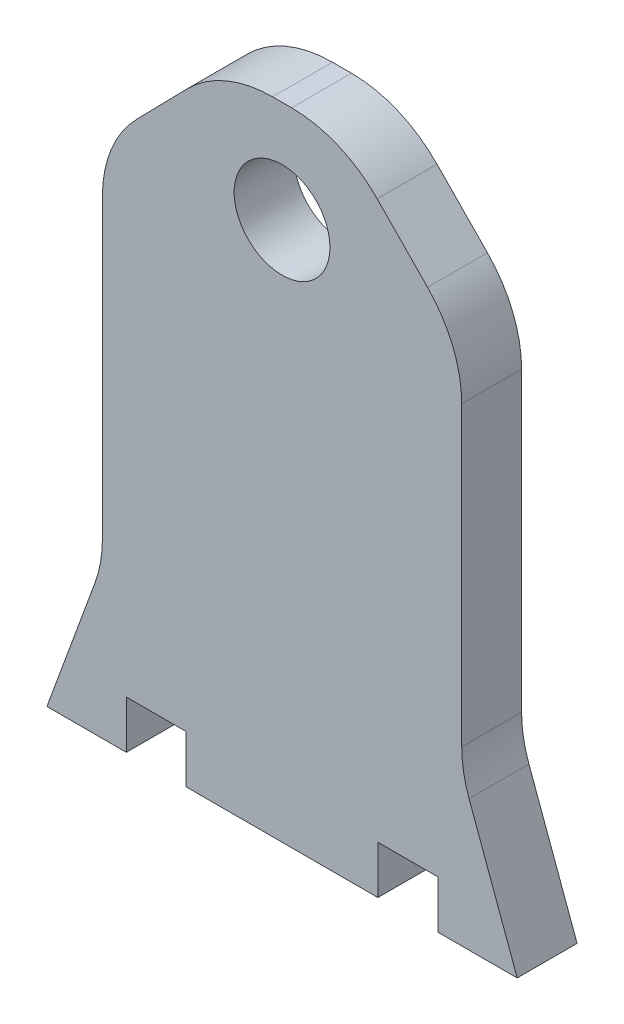
ISO-10303-21;
HEADER;
FILE_DESCRIPTION(('STEP AP214'),'2;1');
FILE_NAME('part.step','',(''),(''),'','','');
FILE_SCHEMA(('AUTOMOTIVE_DESIGN { 1 0 10303 214 1 1 1 1 }'));
ENDSEC;
DATA;
#1=APPLICATION_CONTEXT('core data for automotive mechanical design processes');
#2=APPLICATION_PROTOCOL_DEFINITION('international standard','automotive_design',2000,#1);
#3=PRODUCT_CONTEXT('',#1,'mechanical');
#4=PRODUCT('Part','Part','',(#3));
#5=PRODUCT_RELATED_PRODUCT_CATEGORY('part','',(#4));
#6=PRODUCT_DEFINITION_FORMATION('','',#4);
#7=PRODUCT_DEFINITION_CONTEXT('part definition',#1,'design');
#8=PRODUCT_DEFINITION('design','',#6,#7);
#9=PRODUCT_DEFINITION_SHAPE('','',#8);
#10=(LENGTH_UNIT() NAMED_UNIT(*) SI_UNIT(.MILLI.,.METRE.));
#11=(NAMED_UNIT(*) PLANE_ANGLE_UNIT() SI_UNIT($,.RADIAN.));
#12=(NAMED_UNIT(*) SI_UNIT($,.STERADIAN.) SOLID_ANGLE_UNIT());
#13=UNCERTAINTY_MEASURE_WITH_UNIT(LENGTH_MEASURE(1.E-05),#10,'distance_accuracy_value','');
#14=(GEOMETRIC_REPRESENTATION_CONTEXT(3) GLOBAL_UNCERTAINTY_ASSIGNED_CONTEXT((#13)) GLOBAL_UNIT_ASSIGNED_CONTEXT((#10,
#11,#12)) REPRESENTATION_CONTEXT('',''));
#15=CARTESIAN_POINT('',(0.,0.,0.));
#16=DIRECTION('',(0.,0.,1.));
#17=DIRECTION('',(1.,0.,0.));
#18=AXIS2_PLACEMENT_3D('',#15,#16,#17);
#19=CARTESIAN_POINT('',(15.,-33.5,5.));
#20=DIRECTION('',(-1.,0.,0.));
#21=DIRECTION('',(0.,0.,1.));
#22=AXIS2_PLACEMENT_3D('',#19,#20,#21);
#23=PLANE('',#22);
#24=DIRECTION('',(0.,1.,0.));
#25=VECTOR('',#24,1.);
#26=CARTESIAN_POINT('',(15.,-33.5,5.));
#27=LINE('',#26,#25);
#28=CARTESIAN_POINT('',(15.,-18.0980728460624,5.));
#29=VERTEX_POINT('',#28);
#30=CARTESIAN_POINT('',(15.,6.70234804023753,5.));
#31=VERTEX_POINT('',#30);
#32=EDGE_CURVE('E277',#29,#31,#27,.T.);
#33=ORIENTED_EDGE('',*,*,#32,.F.);
#34=DIRECTION('',(0.,0.,1.));
#35=VECTOR('',#34,1.);
#36=CARTESIAN_POINT('',(15.,-18.0980728460624,5.));
#37=LINE('',#36,#35);
#38=CARTESIAN_POINT('',(15.,-18.0980728460624,0.));
#39=VERTEX_POINT('',#38);
#40=EDGE_CURVE('E58',#29,#39,#37,.F.);
#41=ORIENTED_EDGE('',*,*,#40,.T.);
#42=DIRECTION('',(0.,1.,0.));
#43=VECTOR('',#42,1.);
#44=CARTESIAN_POINT('',(15.,-33.5,0.));
#45=LINE('',#44,#43);
#46=CARTESIAN_POINT('',(15.,6.70234804023753,0.));
#47=VERTEX_POINT('',#46);
#48=EDGE_CURVE('E274',#39,#47,#45,.T.);
#49=ORIENTED_EDGE('',*,*,#48,.T.);
#50=DIRECTION('',(0.,0.,1.));
#51=VECTOR('',#50,1.);
#52=CARTESIAN_POINT('',(15.,6.70234804023753,5.));
#53=LINE('',#52,#51);
#54=EDGE_CURVE('E194',#47,#31,#53,.T.);
#55=ORIENTED_EDGE('',*,*,#54,.T.);
#56=EDGE_LOOP('',(#33,#41,#49,#55));
#57=FACE_BOUND('',#56,.T.);
#58=ADVANCED_FACE('F37',(#57),#23,.F.);
#59=CARTESIAN_POINT('',(0.,0.,5.));
#60=DIRECTION('',(0.,0.,-1.));
#61=DIRECTION('',(-1.,0.,0.));
#62=AXIS2_PLACEMENT_3D('',#59,#60,#61);
#63=PLANE('',#62);
#64=DIRECTION('',(-0.344507703036126,0.938783490773444,0.));
#65=VECTOR('',#64,1.);
#66=CARTESIAN_POINT('',(15.,-19.875,5.));
#67=LINE('',#66,#65);
#68=CARTESIAN_POINT('',(19.6330275229358,-32.5,5.));
#69=VERTEX_POINT('',#68);
#70=CARTESIAN_POINT('',(15.6121650922656,-21.5431498764237,5.));
#71=VERTEX_POINT('',#70);
#72=EDGE_CURVE('E200',#69,#71,#67,.T.);
#73=ORIENTED_EDGE('',*,*,#72,.T.);
#74=CARTESIAN_POINT('',(25.,-18.0980728460624,5.));
#75=DIRECTION('',(0.,0.,-1.));
#76=DIRECTION('',(-1.,0.,0.));
#77=AXIS2_PLACEMENT_3D('',#74,#75,#76);
#78=CIRCLE('',#77,10.);
#79=EDGE_CURVE('E45',#71,#29,#78,.T.);
#80=ORIENTED_EDGE('',*,*,#79,.T.);
#81=ORIENTED_EDGE('',*,*,#32,.T.);
#82=CARTESIAN_POINT('',(5.,6.70234804023753,5.));
#83=DIRECTION('',(0.,0.,-1.));
#84=DIRECTION('',(-1.,0.,0.));
#85=AXIS2_PLACEMENT_3D('',#82,#83,#84);
#86=CIRCLE('',#85,10.);
#87=CARTESIAN_POINT('',(12.1471525735543,13.6965034638992,5.));
#88=VERTEX_POINT('',#87);
#89=EDGE_CURVE('E293',#31,#88,#86,.F.);
#90=ORIENTED_EDGE('',*,*,#89,.T.);
#91=DIRECTION('',(0.699415542366169,-0.714715257355429,0.));
#92=VECTOR('',#91,1.);
#93=CARTESIAN_POINT('',(15.,10.78125,5.));
#94=LINE('',#93,#92);
#95=CARTESIAN_POINT('',(7.94149927959712,17.9941554236617,5.));
#96=VERTEX_POINT('',#95);
#97=EDGE_CURVE('E376',#96,#88,#94,.T.);
#98=ORIENTED_EDGE('',*,*,#97,.F.);
#99=CARTESIAN_POINT('',(0.794346706042831,11.,5.));
#100=DIRECTION('',(0.,0.,-1.));
#101=DIRECTION('',(-1.,0.,0.));
#102=AXIS2_PLACEMENT_3D('',#99,#100,#101);
#103=CIRCLE('',#102,10.);
#104=CARTESIAN_POINT('',(0.794346706042831,21.,5.));
#105=VERTEX_POINT('',#104);
#106=EDGE_CURVE('E289',#96,#105,#103,.F.);
#107=ORIENTED_EDGE('',*,*,#106,.T.);
#108=DIRECTION('',(1.,0.,0.));
#109=VECTOR('',#108,1.);
#110=CARTESIAN_POINT('',(-15.,21.,5.));
#111=LINE('',#110,#109);
#112=CARTESIAN_POINT('',(-0.794346706042826,21.,5.));
#113=VERTEX_POINT('',#112);
#114=EDGE_CURVE('E243',#113,#105,#111,.T.);
#115=ORIENTED_EDGE('',*,*,#114,.F.);
#116=CARTESIAN_POINT('',(-0.794346706042825,11.,5.));
#117=DIRECTION('',(0.,0.,-1.));
#118=DIRECTION('',(-1.,0.,0.));
#119=AXIS2_PLACEMENT_3D('',#116,#117,#118);
#120=CIRCLE('',#119,10.);
#121=CARTESIAN_POINT('',(-7.94149927959712,17.9941554236617,5.));
#122=VERTEX_POINT('',#121);
#123=EDGE_CURVE('E287',#113,#122,#120,.F.);
#124=ORIENTED_EDGE('',*,*,#123,.T.);
#125=DIRECTION('',(0.699415542366169,0.714715257355429,0.));
#126=VECTOR('',#125,1.);
#127=CARTESIAN_POINT('',(-15.,10.78125,5.));
#128=LINE('',#127,#126);
#129=CARTESIAN_POINT('',(-12.1471525735543,13.6965034638992,5.));
#130=VERTEX_POINT('',#129);
#131=EDGE_CURVE('E374',#130,#122,#128,.T.);
#132=ORIENTED_EDGE('',*,*,#131,.F.);
#133=CARTESIAN_POINT('',(-5.,6.70234804023752,5.));
#134=DIRECTION('',(0.,0.,-1.));
#135=DIRECTION('',(-1.,0.,0.));
#136=AXIS2_PLACEMENT_3D('',#133,#134,#135);
#137=CIRCLE('',#136,10.);
#138=CARTESIAN_POINT('',(-15.,6.70234804023752,5.));
#139=VERTEX_POINT('',#138);
#140=EDGE_CURVE('E291',#130,#139,#137,.F.);
#141=ORIENTED_EDGE('',*,*,#140,.T.);
#142=DIRECTION('',(0.,-1.,0.));
#143=VECTOR('',#142,1.);
#144=CARTESIAN_POINT('',(-15.,-33.5,5.));
#145=LINE('',#144,#143);
#146=CARTESIAN_POINT('',(-15.,-18.0980728460624,5.));
#147=VERTEX_POINT('',#146);
#148=EDGE_CURVE('E195',#139,#147,#145,.T.);
#149=ORIENTED_EDGE('',*,*,#148,.T.);
#150=CARTESIAN_POINT('',(-25.,-18.0980728460624,5.));
#151=DIRECTION('',(0.,0.,-1.));
#152=DIRECTION('',(-1.,0.,0.));
#153=AXIS2_PLACEMENT_3D('',#150,#151,#152);
#154=CIRCLE('',#153,10.);
#155=CARTESIAN_POINT('',(-15.6121650922656,-21.5431498764237,5.));
#156=VERTEX_POINT('',#155);
#157=EDGE_CURVE('E328',#147,#156,#154,.T.);
#158=ORIENTED_EDGE('',*,*,#157,.T.);
#159=DIRECTION('',(-0.344507703036126,-0.938783490773444,0.));
#160=VECTOR('',#159,1.);
#161=CARTESIAN_POINT('',(-15.,-19.875,5.));
#162=LINE('',#161,#160);
#163=CARTESIAN_POINT('',(-19.6330275229358,-32.5,5.));
#164=VERTEX_POINT('',#163);
#165=EDGE_CURVE('E211',#156,#164,#162,.T.);
#166=ORIENTED_EDGE('',*,*,#165,.T.);
#167=DIRECTION('',(-1.,0.,0.));
#168=VECTOR('',#167,1.);
#169=CARTESIAN_POINT('',(-20.,-32.5,5.));
#170=LINE('',#169,#168);
#171=CARTESIAN_POINT('',(-13.,-32.5,5.));
#172=VERTEX_POINT('',#171);
#173=EDGE_CURVE('E206',#172,#164,#170,.T.);
#174=ORIENTED_EDGE('',*,*,#173,.F.);
#175=DIRECTION('',(0.,-1.,0.));
#176=VECTOR('',#175,1.);
#177=CARTESIAN_POINT('',(-13.,-33.5,5.));
#178=LINE('',#177,#176);
#179=CARTESIAN_POINT('',(-13.,-28.5,5.));
#180=VERTEX_POINT('',#179);
#181=EDGE_CURVE('E251',#180,#172,#178,.T.);
#182=ORIENTED_EDGE('',*,*,#181,.F.);
#183=DIRECTION('',(-1.,0.,0.));
#184=VECTOR('',#183,1.);
#185=CARTESIAN_POINT('',(-13.,-28.5,5.));
#186=LINE('',#185,#184);
#187=CARTESIAN_POINT('',(-8.,-28.5,5.));
#188=VERTEX_POINT('',#187);
#189=EDGE_CURVE('E254',#188,#180,#186,.T.);
#190=ORIENTED_EDGE('',*,*,#189,.F.);
#191=DIRECTION('',(0.,1.,0.));
#192=VECTOR('',#191,1.);
#193=CARTESIAN_POINT('',(-8.,-33.5,5.));
#194=LINE('',#193,#192);
#195=CARTESIAN_POINT('',(-8.,-32.5,5.));
#196=VERTEX_POINT('',#195);
#197=EDGE_CURVE('E237',#196,#188,#194,.T.);
#198=ORIENTED_EDGE('',*,*,#197,.F.);
#199=CARTESIAN_POINT('',(8.,-32.5,5.));
#200=VERTEX_POINT('',#199);
#201=EDGE_CURVE('E204',#200,#196,#170,.T.);
#202=ORIENTED_EDGE('',*,*,#201,.F.);
#203=DIRECTION('',(0.,-1.,0.));
#204=VECTOR('',#203,1.);
#205=CARTESIAN_POINT('',(8.,-33.5,5.));
#206=LINE('',#205,#204);
#207=CARTESIAN_POINT('',(8.,-28.5,5.));
#208=VERTEX_POINT('',#207);
#209=EDGE_CURVE('E234',#208,#200,#206,.T.);
#210=ORIENTED_EDGE('',*,*,#209,.F.);
#211=DIRECTION('',(-1.,0.,0.));
#212=VECTOR('',#211,1.);
#213=CARTESIAN_POINT('',(8.,-28.5,5.));
#214=LINE('',#213,#212);
#215=CARTESIAN_POINT('',(13.,-28.5,5.));
#216=VERTEX_POINT('',#215);
#217=EDGE_CURVE('E228',#216,#208,#214,.T.);
#218=ORIENTED_EDGE('',*,*,#217,.F.);
#219=DIRECTION('',(0.,1.,0.));
#220=VECTOR('',#219,1.);
#221=CARTESIAN_POINT('',(13.,-33.5,5.));
#222=LINE('',#221,#220);
#223=CARTESIAN_POINT('',(13.,-32.5,5.));
#224=VERTEX_POINT('',#223);
#225=EDGE_CURVE('E202',#224,#216,#222,.T.);
#226=ORIENTED_EDGE('',*,*,#225,.F.);
#227=EDGE_CURVE('E186',#69,#224,#170,.T.);
#228=ORIENTED_EDGE('',*,*,#227,.F.);
#229=EDGE_LOOP('',(#73,#80,#81,#90,#98,#107,#115,#124,#132,#141,#149,#158,#166,#174,#182,#190,
#198,#202,#210,#218,#226,#228));
#230=FACE_BOUND('',#229,.T.);
#231=CARTESIAN_POINT('',(0.,12.5,5.));
#232=DIRECTION('',(0.,0.,1.));
#233=DIRECTION('',(1.,0.,0.));
#234=AXIS2_PLACEMENT_3D('',#231,#232,#233);
#235=CIRCLE('',#234,4.);
#236=CARTESIAN_POINT('',(4.,12.5,5.));
#237=VERTEX_POINT('',#236);
#238=EDGE_CURVE('E271',#237,#237,#235,.T.);
#239=ORIENTED_EDGE('',*,*,#238,.F.);
#240=EDGE_LOOP('',(#239));
#241=FACE_BOUND('',#240,.T.);
#242=ADVANCED_FACE('F198',(#230,#241),#63,.F.);
#243=CARTESIAN_POINT('',(0.,0.,0.));
#244=DIRECTION('',(0.,0.,-1.));
#245=DIRECTION('',(-1.,0.,0.));
#246=AXIS2_PLACEMENT_3D('',#243,#244,#245);
#247=PLANE('',#246);
#248=DIRECTION('',(0.699415542366169,-0.714715257355429,0.));
#249=VECTOR('',#248,1.);
#250=CARTESIAN_POINT('',(15.,10.78125,0.));
#251=LINE('',#250,#249);
#252=CARTESIAN_POINT('',(7.94149927959712,17.9941554236617,0.));
#253=VERTEX_POINT('',#252);
#254=CARTESIAN_POINT('',(12.1471525735543,13.6965034638992,0.));
#255=VERTEX_POINT('',#254);
#256=EDGE_CURVE('E219',#253,#255,#251,.T.);
#257=ORIENTED_EDGE('',*,*,#256,.T.);
#258=CARTESIAN_POINT('',(5.,6.70234804023753,0.));
#259=DIRECTION('',(0.,0.,-1.));
#260=DIRECTION('',(-1.,0.,0.));
#261=AXIS2_PLACEMENT_3D('',#258,#259,#260);
#262=CIRCLE('',#261,10.);
#263=EDGE_CURVE('E306',#255,#47,#262,.T.);
#264=ORIENTED_EDGE('',*,*,#263,.T.);
#265=ORIENTED_EDGE('',*,*,#48,.F.);
#266=CARTESIAN_POINT('',(25.,-18.0980728460624,0.));
#267=DIRECTION('',(0.,0.,-1.));
#268=DIRECTION('',(-1.,0.,0.));
#269=AXIS2_PLACEMENT_3D('',#266,#267,#268);
#270=CIRCLE('',#269,10.);
#271=CARTESIAN_POINT('',(15.6121650922656,-21.5431498764237,0.));
#272=VERTEX_POINT('',#271);
#273=EDGE_CURVE('E11',#39,#272,#270,.F.);
#274=ORIENTED_EDGE('',*,*,#273,.T.);
#275=DIRECTION('',(-0.344507703036126,0.938783490773444,0.));
#276=VECTOR('',#275,1.);
#277=CARTESIAN_POINT('',(15.,-19.875,0.));
#278=LINE('',#277,#276);
#279=CARTESIAN_POINT('',(19.6330275229358,-32.5,0.));
#280=VERTEX_POINT('',#279);
#281=EDGE_CURVE('E212',#280,#272,#278,.T.);
#282=ORIENTED_EDGE('',*,*,#281,.F.);
#283=DIRECTION('',(-1.,0.,0.));
#284=VECTOR('',#283,1.);
#285=CARTESIAN_POINT('',(-20.,-32.5,0.));
#286=LINE('',#285,#284);
#287=CARTESIAN_POINT('',(13.,-32.5,0.));
#288=VERTEX_POINT('',#287);
#289=EDGE_CURVE('E189',#280,#288,#286,.T.);
#290=ORIENTED_EDGE('',*,*,#289,.T.);
#291=DIRECTION('',(0.,1.,0.));
#292=VECTOR('',#291,1.);
#293=CARTESIAN_POINT('',(13.,-33.5,0.));
#294=LINE('',#293,#292);
#295=CARTESIAN_POINT('',(13.,-28.5,0.));
#296=VERTEX_POINT('',#295);
#297=EDGE_CURVE('E227',#288,#296,#294,.T.);
#298=ORIENTED_EDGE('',*,*,#297,.T.);
#299=DIRECTION('',(-1.,0.,0.));
#300=VECTOR('',#299,1.);
#301=CARTESIAN_POINT('',(8.,-28.5,0.));
#302=LINE('',#301,#300);
#303=CARTESIAN_POINT('',(8.,-28.5,0.));
#304=VERTEX_POINT('',#303);
#305=EDGE_CURVE('E230',#296,#304,#302,.T.);
#306=ORIENTED_EDGE('',*,*,#305,.T.);
#307=DIRECTION('',(0.,-1.,0.));
#308=VECTOR('',#307,1.);
#309=CARTESIAN_POINT('',(8.,-33.5,0.));
#310=LINE('',#309,#308);
#311=CARTESIAN_POINT('',(8.,-32.5,0.));
#312=VERTEX_POINT('',#311);
#313=EDGE_CURVE('E224',#304,#312,#310,.T.);
#314=ORIENTED_EDGE('',*,*,#313,.T.);
#315=CARTESIAN_POINT('',(-8.,-32.5,0.));
#316=VERTEX_POINT('',#315);
#317=EDGE_CURVE('E361',#312,#316,#286,.T.);
#318=ORIENTED_EDGE('',*,*,#317,.T.);
#319=DIRECTION('',(0.,1.,0.));
#320=VECTOR('',#319,1.);
#321=CARTESIAN_POINT('',(-8.,-33.5,0.));
#322=LINE('',#321,#320);
#323=CARTESIAN_POINT('',(-8.,-28.5,0.));
#324=VERTEX_POINT('',#323);
#325=EDGE_CURVE('E255',#316,#324,#322,.T.);
#326=ORIENTED_EDGE('',*,*,#325,.T.);
#327=DIRECTION('',(-1.,0.,0.));
#328=VECTOR('',#327,1.);
#329=CARTESIAN_POINT('',(-13.,-28.5,0.));
#330=LINE('',#329,#328);
#331=CARTESIAN_POINT('',(-13.,-28.5,0.));
#332=VERTEX_POINT('',#331);
#333=EDGE_CURVE('E261',#324,#332,#330,.T.);
#334=ORIENTED_EDGE('',*,*,#333,.T.);
#335=DIRECTION('',(0.,-1.,0.));
#336=VECTOR('',#335,1.);
#337=CARTESIAN_POINT('',(-13.,-33.5,0.));
#338=LINE('',#337,#336);
#339=CARTESIAN_POINT('',(-13.,-32.5,0.));
#340=VERTEX_POINT('',#339);
#341=EDGE_CURVE('E249',#332,#340,#338,.T.);
#342=ORIENTED_EDGE('',*,*,#341,.T.);
#343=CARTESIAN_POINT('',(-19.6330275229358,-32.5,0.));
#344=VERTEX_POINT('',#343);
#345=EDGE_CURVE('E203',#340,#344,#286,.T.);
#346=ORIENTED_EDGE('',*,*,#345,.T.);
#347=DIRECTION('',(-0.344507703036126,-0.938783490773444,0.));
#348=VECTOR('',#347,1.);
#349=CARTESIAN_POINT('',(-15.,-19.875,0.));
#350=LINE('',#349,#348);
#351=CARTESIAN_POINT('',(-15.6121650922656,-21.5431498764237,0.));
#352=VERTEX_POINT('',#351);
#353=EDGE_CURVE('E214',#352,#344,#350,.T.);
#354=ORIENTED_EDGE('',*,*,#353,.F.);
#355=CARTESIAN_POINT('',(-25.,-18.0980728460624,0.));
#356=DIRECTION('',(0.,0.,-1.));
#357=DIRECTION('',(-1.,0.,0.));
#358=AXIS2_PLACEMENT_3D('',#355,#356,#357);
#359=CIRCLE('',#358,10.);
#360=CARTESIAN_POINT('',(-15.,-18.0980728460624,0.));
#361=VERTEX_POINT('',#360);
#362=EDGE_CURVE('E330',#352,#361,#359,.F.);
#363=ORIENTED_EDGE('',*,*,#362,.T.);
#364=DIRECTION('',(0.,-1.,0.));
#365=VECTOR('',#364,1.);
#366=CARTESIAN_POINT('',(-15.,-33.5,0.));
#367=LINE('',#366,#365);
#368=CARTESIAN_POINT('',(-15.,6.70234804023752,0.));
#369=VERTEX_POINT('',#368);
#370=EDGE_CURVE('E279',#369,#361,#367,.T.);
#371=ORIENTED_EDGE('',*,*,#370,.F.);
#372=CARTESIAN_POINT('',(-5.,6.70234804023752,0.));
#373=DIRECTION('',(0.,0.,-1.));
#374=DIRECTION('',(-1.,0.,0.));
#375=AXIS2_PLACEMENT_3D('',#372,#373,#374);
#376=CIRCLE('',#375,10.);
#377=CARTESIAN_POINT('',(-12.1471525735543,13.6965034638992,0.));
#378=VERTEX_POINT('',#377);
#379=EDGE_CURVE('E304',#369,#378,#376,.T.);
#380=ORIENTED_EDGE('',*,*,#379,.T.);
#381=DIRECTION('',(0.699415542366169,0.714715257355429,0.));
#382=VECTOR('',#381,1.);
#383=CARTESIAN_POINT('',(-15.,10.78125,0.));
#384=LINE('',#383,#382);
#385=CARTESIAN_POINT('',(-7.94149927959712,17.9941554236617,0.));
#386=VERTEX_POINT('',#385);
#387=EDGE_CURVE('E216',#378,#386,#384,.T.);
#388=ORIENTED_EDGE('',*,*,#387,.T.);
#389=CARTESIAN_POINT('',(-0.794346706042825,11.,0.));
#390=DIRECTION('',(0.,0.,-1.));
#391=DIRECTION('',(-1.,0.,0.));
#392=AXIS2_PLACEMENT_3D('',#389,#390,#391);
#393=CIRCLE('',#392,10.);
#394=CARTESIAN_POINT('',(-0.794346706042826,21.,0.));
#395=VERTEX_POINT('',#394);
#396=EDGE_CURVE('E300',#386,#395,#393,.T.);
#397=ORIENTED_EDGE('',*,*,#396,.T.);
#398=DIRECTION('',(1.,0.,0.));
#399=VECTOR('',#398,1.);
#400=CARTESIAN_POINT('',(-15.,21.,0.));
#401=LINE('',#400,#399);
#402=CARTESIAN_POINT('',(0.794346706042831,21.,0.));
#403=VERTEX_POINT('',#402);
#404=EDGE_CURVE('E265',#395,#403,#401,.T.);
#405=ORIENTED_EDGE('',*,*,#404,.T.);
#406=CARTESIAN_POINT('',(0.794346706042831,11.,0.));
#407=DIRECTION('',(0.,0.,-1.));
#408=DIRECTION('',(-1.,0.,0.));
#409=AXIS2_PLACEMENT_3D('',#406,#407,#408);
#410=CIRCLE('',#409,10.);
#411=EDGE_CURVE('E302',#403,#253,#410,.T.);
#412=ORIENTED_EDGE('',*,*,#411,.T.);
#413=EDGE_LOOP('',(#257,#264,#265,#274,#282,#290,#298,#306,#314,#318,#326,#334,#342,#346,#354,
#363,#371,#380,#388,#397,#405,#412));
#414=FACE_BOUND('',#413,.T.);
#415=CARTESIAN_POINT('',(0.,12.5,0.));
#416=DIRECTION('',(0.,0.,1.));
#417=DIRECTION('',(1.,0.,0.));
#418=AXIS2_PLACEMENT_3D('',#415,#416,#417);
#419=CIRCLE('',#418,4.);
#420=CARTESIAN_POINT('',(4.,12.5,0.));
#421=VERTEX_POINT('',#420);
#422=EDGE_CURVE('E268',#421,#421,#419,.T.);
#423=ORIENTED_EDGE('',*,*,#422,.T.);
#424=EDGE_LOOP('',(#423));
#425=FACE_BOUND('',#424,.T.);
#426=ADVANCED_FACE('F336',(#414,#425),#247,.T.);
#427=CARTESIAN_POINT('',(-15.,-33.5,5.));
#428=DIRECTION('',(1.,0.,0.));
#429=DIRECTION('',(0.,0.,-1.));
#430=AXIS2_PLACEMENT_3D('',#427,#428,#429);
#431=PLANE('',#430);
#432=ORIENTED_EDGE('',*,*,#370,.T.);
#433=DIRECTION('',(0.,0.,1.));
#434=VECTOR('',#433,1.);
#435=CARTESIAN_POINT('',(-15.,-18.0980728460624,5.));
#436=LINE('',#435,#434);
#437=EDGE_CURVE('E321',#361,#147,#436,.T.);
#438=ORIENTED_EDGE('',*,*,#437,.T.);
#439=ORIENTED_EDGE('',*,*,#148,.F.);
#440=DIRECTION('',(0.,0.,1.));
#441=VECTOR('',#440,1.);
#442=CARTESIAN_POINT('',(-15.,6.70234804023752,5.));
#443=LINE('',#442,#441);
#444=EDGE_CURVE('E314',#139,#369,#443,.F.);
#445=ORIENTED_EDGE('',*,*,#444,.T.);
#446=EDGE_LOOP('',(#432,#438,#439,#445));
#447=FACE_BOUND('',#446,.T.);
#448=ADVANCED_FACE('F344',(#447),#431,.F.);
#449=CARTESIAN_POINT('',(0.,12.5,5.));
#450=DIRECTION('',(0.,0.,-1.));
#451=DIRECTION('',(-1.,0.,0.));
#452=AXIS2_PLACEMENT_3D('',#449,#450,#451);
#453=CYLINDRICAL_SURFACE('',#452,4.);
#454=ORIENTED_EDGE('',*,*,#238,.T.);
#455=EDGE_LOOP('',(#454));
#456=FACE_BOUND('',#455,.T.);
#457=ORIENTED_EDGE('',*,*,#422,.F.);
#458=EDGE_LOOP('',(#457));
#459=FACE_BOUND('',#458,.T.);
#460=ADVANCED_FACE('F474',(#456,#459),#453,.F.);
#461=CARTESIAN_POINT('',(-15.,21.,0.));
#462=DIRECTION('',(0.,-1.,0.));
#463=DIRECTION('',(1.,0.,0.));
#464=AXIS2_PLACEMENT_3D('',#461,#462,#463);
#465=PLANE('',#464);
#466=ORIENTED_EDGE('',*,*,#114,.T.);
#467=DIRECTION('',(0.,0.,1.));
#468=VECTOR('',#467,1.);
#469=CARTESIAN_POINT('',(0.794346706042831,21.,0.));
#470=LINE('',#469,#468);
#471=EDGE_CURVE('E319',#105,#403,#470,.F.);
#472=ORIENTED_EDGE('',*,*,#471,.T.);
#473=ORIENTED_EDGE('',*,*,#404,.F.);
#474=DIRECTION('',(0.,0.,1.));
#475=VECTOR('',#474,1.);
#476=CARTESIAN_POINT('',(-0.794346706042826,21.,0.));
#477=LINE('',#476,#475);
#478=EDGE_CURVE('E316',#395,#113,#477,.T.);
#479=ORIENTED_EDGE('',*,*,#478,.T.);
#480=EDGE_LOOP('',(#466,#472,#473,#479));
#481=FACE_BOUND('',#480,.T.);
#482=ADVANCED_FACE('F426',(#481),#465,.F.);
#483=CARTESIAN_POINT('',(-8.,-33.5,0.));
#484=DIRECTION('',(1.,0.,0.));
#485=DIRECTION('',(0.,0.,-1.));
#486=AXIS2_PLACEMENT_3D('',#483,#484,#485);
#487=PLANE('',#486);
#488=ORIENTED_EDGE('',*,*,#325,.F.);
#489=DIRECTION('',(0.,0.,1.));
#490=VECTOR('',#489,1.);
#491=CARTESIAN_POINT('',(-8.,-32.5,0.));
#492=LINE('',#491,#490);
#493=EDGE_CURVE('E369',#316,#196,#492,.T.);
#494=ORIENTED_EDGE('',*,*,#493,.T.);
#495=ORIENTED_EDGE('',*,*,#197,.T.);
#496=DIRECTION('',(0.,0.,1.));
#497=VECTOR('',#496,1.);
#498=CARTESIAN_POINT('',(-8.,-28.5,0.));
#499=LINE('',#498,#497);
#500=EDGE_CURVE('E246',#324,#188,#499,.T.);
#501=ORIENTED_EDGE('',*,*,#500,.F.);
#502=EDGE_LOOP('',(#488,#494,#495,#501));
#503=FACE_BOUND('',#502,.T.);
#504=ADVANCED_FACE('F461',(#503),#487,.F.);
#505=CARTESIAN_POINT('',(-13.,-33.5,0.));
#506=DIRECTION('',(-1.,0.,0.));
#507=DIRECTION('',(0.,0.,1.));
#508=AXIS2_PLACEMENT_3D('',#505,#506,#507);
#509=PLANE('',#508);
#510=ORIENTED_EDGE('',*,*,#181,.T.);
#511=DIRECTION('',(0.,0.,-1.));
#512=VECTOR('',#511,1.);
#513=CARTESIAN_POINT('',(-13.,-32.5,0.));
#514=LINE('',#513,#512);
#515=EDGE_CURVE('E366',#172,#340,#514,.T.);
#516=ORIENTED_EDGE('',*,*,#515,.T.);
#517=ORIENTED_EDGE('',*,*,#341,.F.);
#518=DIRECTION('',(0.,0.,1.));
#519=VECTOR('',#518,1.);
#520=CARTESIAN_POINT('',(-13.,-28.5,0.));
#521=LINE('',#520,#519);
#522=EDGE_CURVE('E222',#332,#180,#521,.T.);
#523=ORIENTED_EDGE('',*,*,#522,.T.);
#524=EDGE_LOOP('',(#510,#516,#517,#523));
#525=FACE_BOUND('',#524,.T.);
#526=ADVANCED_FACE('F464',(#525),#509,.F.);
#527=CARTESIAN_POINT('',(-13.,-28.5,0.));
#528=DIRECTION('',(0.,1.,0.));
#529=DIRECTION('',(0.,0.,1.));
#530=AXIS2_PLACEMENT_3D('',#527,#528,#529);
#531=PLANE('',#530);
#532=ORIENTED_EDGE('',*,*,#189,.T.);
#533=ORIENTED_EDGE('',*,*,#522,.F.);
#534=ORIENTED_EDGE('',*,*,#333,.F.);
#535=ORIENTED_EDGE('',*,*,#500,.T.);
#536=EDGE_LOOP('',(#532,#533,#534,#535));
#537=FACE_BOUND('',#536,.T.);
#538=ADVANCED_FACE('F459',(#537),#531,.F.);
#539=CARTESIAN_POINT('',(8.,-33.5,0.));
#540=DIRECTION('',(-1.,0.,0.));
#541=DIRECTION('',(0.,0.,1.));
#542=AXIS2_PLACEMENT_3D('',#539,#540,#541);
#543=PLANE('',#542);
#544=ORIENTED_EDGE('',*,*,#209,.T.);
#545=DIRECTION('',(0.,0.,-1.));
#546=VECTOR('',#545,1.);
#547=CARTESIAN_POINT('',(8.,-32.5,0.));
#548=LINE('',#547,#546);
#549=EDGE_CURVE('E359',#200,#312,#548,.T.);
#550=ORIENTED_EDGE('',*,*,#549,.T.);
#551=ORIENTED_EDGE('',*,*,#313,.F.);
#552=DIRECTION('',(0.,0.,1.));
#553=VECTOR('',#552,1.);
#554=CARTESIAN_POINT('',(8.,-28.5,0.));
#555=LINE('',#554,#553);
#556=EDGE_CURVE('E241',#304,#208,#555,.T.);
#557=ORIENTED_EDGE('',*,*,#556,.T.);
#558=EDGE_LOOP('',(#544,#550,#551,#557));
#559=FACE_BOUND('',#558,.T.);
#560=ADVANCED_FACE('F452',(#559),#543,.F.);
#561=CARTESIAN_POINT('',(8.,-28.5,0.));
#562=DIRECTION('',(0.,1.,0.));
#563=DIRECTION('',(0.,0.,1.));
#564=AXIS2_PLACEMENT_3D('',#561,#562,#563);
#565=PLANE('',#564);
#566=ORIENTED_EDGE('',*,*,#217,.T.);
#567=ORIENTED_EDGE('',*,*,#556,.F.);
#568=ORIENTED_EDGE('',*,*,#305,.F.);
#569=DIRECTION('',(0.,0.,1.));
#570=VECTOR('',#569,1.);
#571=CARTESIAN_POINT('',(13.,-28.5,0.));
#572=LINE('',#571,#570);
#573=EDGE_CURVE('E233',#296,#216,#572,.T.);
#574=ORIENTED_EDGE('',*,*,#573,.T.);
#575=EDGE_LOOP('',(#566,#567,#568,#574));
#576=FACE_BOUND('',#575,.T.);
#577=ADVANCED_FACE('F449',(#576),#565,.F.);
#578=CARTESIAN_POINT('',(13.,-33.5,0.));
#579=DIRECTION('',(1.,0.,0.));
#580=DIRECTION('',(0.,0.,-1.));
#581=AXIS2_PLACEMENT_3D('',#578,#579,#580);
#582=PLANE('',#581);
#583=ORIENTED_EDGE('',*,*,#297,.F.);
#584=DIRECTION('',(0.,0.,1.));
#585=VECTOR('',#584,1.);
#586=CARTESIAN_POINT('',(13.,-32.5,0.));
#587=LINE('',#586,#585);
#588=EDGE_CURVE('E357',#288,#224,#587,.T.);
#589=ORIENTED_EDGE('',*,*,#588,.T.);
#590=ORIENTED_EDGE('',*,*,#225,.T.);
#591=ORIENTED_EDGE('',*,*,#573,.F.);
#592=EDGE_LOOP('',(#583,#589,#590,#591));
#593=FACE_BOUND('',#592,.T.);
#594=ADVANCED_FACE('F448',(#593),#582,.F.);
#595=CARTESIAN_POINT('',(-15.,-19.875,0.));
#596=DIRECTION('',(-0.938783490773444,0.344507703036126,0.));
#597=DIRECTION('',(-0.344507703036126,-0.938783490773444,0.));
#598=AXIS2_PLACEMENT_3D('',#595,#596,#597);
#599=PLANE('',#598);
#600=ORIENTED_EDGE('',*,*,#165,.F.);
#601=DIRECTION('',(0.,0.,1.));
#602=VECTOR('',#601,1.);
#603=CARTESIAN_POINT('',(-15.6121650922656,-21.5431498764237,0.));
#604=LINE('',#603,#602);
#605=EDGE_CURVE('E324',#156,#352,#604,.F.);
#606=ORIENTED_EDGE('',*,*,#605,.T.);
#607=ORIENTED_EDGE('',*,*,#353,.T.);
#608=DIRECTION('',(0.,0.,-1.));
#609=VECTOR('',#608,1.);
#610=CARTESIAN_POINT('',(-19.6330275229358,-32.5,0.));
#611=LINE('',#610,#609);
#612=EDGE_CURVE('E355',#164,#344,#611,.T.);
#613=ORIENTED_EDGE('',*,*,#612,.F.);
#614=EDGE_LOOP('',(#600,#606,#607,#613));
#615=FACE_BOUND('',#614,.T.);
#616=ADVANCED_FACE('F353',(#615),#599,.T.);
#617=CARTESIAN_POINT('',(15.,-19.875,0.));
#618=DIRECTION('',(0.938783490773444,0.344507703036126,0.));
#619=DIRECTION('',(-0.344507703036126,0.938783490773444,0.));
#620=AXIS2_PLACEMENT_3D('',#617,#618,#619);
#621=PLANE('',#620);
#622=ORIENTED_EDGE('',*,*,#281,.T.);
#623=DIRECTION('',(0.,0.,1.));
#624=VECTOR('',#623,1.);
#625=CARTESIAN_POINT('',(15.6121650922656,-21.5431498764237,0.));
#626=LINE('',#625,#624);
#627=EDGE_CURVE('E210',#272,#71,#626,.T.);
#628=ORIENTED_EDGE('',*,*,#627,.T.);
#629=ORIENTED_EDGE('',*,*,#72,.F.);
#630=DIRECTION('',(0.,0.,1.));
#631=VECTOR('',#630,1.);
#632=CARTESIAN_POINT('',(19.6330275229358,-32.5,0.));
#633=LINE('',#632,#631);
#634=EDGE_CURVE('E183',#280,#69,#633,.T.);
#635=ORIENTED_EDGE('',*,*,#634,.F.);
#636=EDGE_LOOP('',(#622,#628,#629,#635));
#637=FACE_BOUND('',#636,.T.);
#638=ADVANCED_FACE('F208',(#637),#621,.T.);
#639=CARTESIAN_POINT('',(15.,10.78125,0.));
#640=DIRECTION('',(-0.714715257355429,-0.699415542366169,0.));
#641=DIRECTION('',(0.699415542366169,-0.714715257355429,0.));
#642=AXIS2_PLACEMENT_3D('',#639,#640,#641);
#643=PLANE('',#642);
#644=ORIENTED_EDGE('',*,*,#97,.T.);
#645=DIRECTION('',(0.,0.,1.));
#646=VECTOR('',#645,1.);
#647=CARTESIAN_POINT('',(12.1471525735543,13.6965034638992,0.));
#648=LINE('',#647,#646);
#649=EDGE_CURVE('E298',#88,#255,#648,.F.);
#650=ORIENTED_EDGE('',*,*,#649,.T.);
#651=ORIENTED_EDGE('',*,*,#256,.F.);
#652=DIRECTION('',(0.,0.,1.));
#653=VECTOR('',#652,1.);
#654=CARTESIAN_POINT('',(7.94149927959712,17.9941554236617,0.));
#655=LINE('',#654,#653);
#656=EDGE_CURVE('E295',#253,#96,#655,.T.);
#657=ORIENTED_EDGE('',*,*,#656,.T.);
#658=EDGE_LOOP('',(#644,#650,#651,#657));
#659=FACE_BOUND('',#658,.T.);
#660=ADVANCED_FACE('F429',(#659),#643,.F.);
#661=CARTESIAN_POINT('',(-15.,10.78125,0.));
#662=DIRECTION('',(0.714715257355429,-0.699415542366169,0.));
#663=DIRECTION('',(0.699415542366169,0.714715257355429,0.));
#664=AXIS2_PLACEMENT_3D('',#661,#662,#663);
#665=PLANE('',#664);
#666=ORIENTED_EDGE('',*,*,#387,.F.);
#667=DIRECTION('',(0.,0.,1.));
#668=VECTOR('',#667,1.);
#669=CARTESIAN_POINT('',(-12.1471525735543,13.6965034638992,0.));
#670=LINE('',#669,#668);
#671=EDGE_CURVE('E311',#378,#130,#670,.T.);
#672=ORIENTED_EDGE('',*,*,#671,.T.);
#673=ORIENTED_EDGE('',*,*,#131,.T.);
#674=DIRECTION('',(0.,0.,1.));
#675=VECTOR('',#674,1.);
#676=CARTESIAN_POINT('',(-7.94149927959712,17.9941554236617,0.));
#677=LINE('',#676,#675);
#678=EDGE_CURVE('E309',#122,#386,#677,.F.);
#679=ORIENTED_EDGE('',*,*,#678,.T.);
#680=EDGE_LOOP('',(#666,#672,#673,#679));
#681=FACE_BOUND('',#680,.T.);
#682=ADVANCED_FACE('F432',(#681),#665,.F.);
#683=CARTESIAN_POINT('',(-20.,-32.5,0.));
#684=DIRECTION('',(0.,1.,0.));
#685=DIRECTION('',(0.,0.,1.));
#686=AXIS2_PLACEMENT_3D('',#683,#684,#685);
#687=PLANE('',#686);
#688=ORIENTED_EDGE('',*,*,#289,.F.);
#689=ORIENTED_EDGE('',*,*,#634,.T.);
#690=ORIENTED_EDGE('',*,*,#227,.T.);
#691=ORIENTED_EDGE('',*,*,#588,.F.);
#692=EDGE_LOOP('',(#688,#689,#690,#691));
#693=FACE_BOUND('',#692,.T.);
#694=ADVANCED_FACE('F185',(#693),#687,.F.);
#695=ORIENTED_EDGE('',*,*,#173,.T.);
#696=ORIENTED_EDGE('',*,*,#612,.T.);
#697=ORIENTED_EDGE('',*,*,#345,.F.);
#698=ORIENTED_EDGE('',*,*,#515,.F.);
#699=EDGE_LOOP('',(#695,#696,#697,#698));
#700=FACE_BOUND('',#699,.T.);
#701=ADVANCED_FACE('F440',(#700),#687,.F.);
#702=ORIENTED_EDGE('',*,*,#317,.F.);
#703=ORIENTED_EDGE('',*,*,#549,.F.);
#704=ORIENTED_EDGE('',*,*,#201,.T.);
#705=ORIENTED_EDGE('',*,*,#493,.F.);
#706=EDGE_LOOP('',(#702,#703,#704,#705));
#707=FACE_BOUND('',#706,.T.);
#708=ADVANCED_FACE('F408',(#707),#687,.F.);
#709=CARTESIAN_POINT('',(5.,6.70234804023753,5.));
#710=DIRECTION('',(0.,0.,1.));
#711=DIRECTION('',(1.,0.,0.));
#712=AXIS2_PLACEMENT_3D('',#709,#710,#711);
#713=CYLINDRICAL_SURFACE('',#712,10.);
#714=ORIENTED_EDGE('',*,*,#263,.F.);
#715=ORIENTED_EDGE('',*,*,#649,.F.);
#716=ORIENTED_EDGE('',*,*,#89,.F.);
#717=ORIENTED_EDGE('',*,*,#54,.F.);
#718=EDGE_LOOP('',(#714,#715,#716,#717));
#719=FACE_BOUND('',#718,.T.);
#720=ADVANCED_FACE('F387',(#719),#713,.T.);
#721=CARTESIAN_POINT('',(-5.,6.70234804023752,0.));
#722=DIRECTION('',(0.,0.,1.));
#723=DIRECTION('',(1.,0.,0.));
#724=AXIS2_PLACEMENT_3D('',#721,#722,#723);
#725=CYLINDRICAL_SURFACE('',#724,10.);
#726=ORIENTED_EDGE('',*,*,#379,.F.);
#727=ORIENTED_EDGE('',*,*,#444,.F.);
#728=ORIENTED_EDGE('',*,*,#140,.F.);
#729=ORIENTED_EDGE('',*,*,#671,.F.);
#730=EDGE_LOOP('',(#726,#727,#728,#729));
#731=FACE_BOUND('',#730,.T.);
#732=ADVANCED_FACE('F407',(#731),#725,.T.);
#733=CARTESIAN_POINT('',(0.794346706042831,11.,0.));
#734=DIRECTION('',(0.,0.,1.));
#735=DIRECTION('',(1.,0.,0.));
#736=AXIS2_PLACEMENT_3D('',#733,#734,#735);
#737=CYLINDRICAL_SURFACE('',#736,10.);
#738=ORIENTED_EDGE('',*,*,#411,.F.);
#739=ORIENTED_EDGE('',*,*,#471,.F.);
#740=ORIENTED_EDGE('',*,*,#106,.F.);
#741=ORIENTED_EDGE('',*,*,#656,.F.);
#742=EDGE_LOOP('',(#738,#739,#740,#741));
#743=FACE_BOUND('',#742,.T.);
#744=ADVANCED_FACE('F411',(#743),#737,.T.);
#745=CARTESIAN_POINT('',(-0.794346706042825,11.,0.));
#746=DIRECTION('',(0.,0.,1.));
#747=DIRECTION('',(1.,0.,0.));
#748=AXIS2_PLACEMENT_3D('',#745,#746,#747);
#749=CYLINDRICAL_SURFACE('',#748,10.);
#750=ORIENTED_EDGE('',*,*,#396,.F.);
#751=ORIENTED_EDGE('',*,*,#678,.F.);
#752=ORIENTED_EDGE('',*,*,#123,.F.);
#753=ORIENTED_EDGE('',*,*,#478,.F.);
#754=EDGE_LOOP('',(#750,#751,#752,#753));
#755=FACE_BOUND('',#754,.T.);
#756=ADVANCED_FACE('F395',(#755),#749,.T.);
#757=CARTESIAN_POINT('',(-25.,-18.0980728460624,5.));
#758=DIRECTION('',(0.,0.,1.));
#759=DIRECTION('',(1.,0.,0.));
#760=AXIS2_PLACEMENT_3D('',#757,#758,#759);
#761=CYLINDRICAL_SURFACE('',#760,10.);
#762=ORIENTED_EDGE('',*,*,#362,.F.);
#763=ORIENTED_EDGE('',*,*,#605,.F.);
#764=ORIENTED_EDGE('',*,*,#157,.F.);
#765=ORIENTED_EDGE('',*,*,#437,.F.);
#766=EDGE_LOOP('',(#762,#763,#764,#765));
#767=FACE_BOUND('',#766,.T.);
#768=ADVANCED_FACE('F347',(#767),#761,.F.);
#769=CARTESIAN_POINT('',(25.,-18.0980728460624,0.));
#770=DIRECTION('',(0.,0.,1.));
#771=DIRECTION('',(1.,0.,0.));
#772=AXIS2_PLACEMENT_3D('',#769,#770,#771);
#773=CYLINDRICAL_SURFACE('',#772,10.);
#774=ORIENTED_EDGE('',*,*,#273,.F.);
#775=ORIENTED_EDGE('',*,*,#40,.F.);
#776=ORIENTED_EDGE('',*,*,#79,.F.);
#777=ORIENTED_EDGE('',*,*,#627,.F.);
#778=EDGE_LOOP('',(#774,#775,#776,#777));
#779=FACE_BOUND('',#778,.T.);
#780=ADVANCED_FACE('F39',(#779),#773,.F.);
#781=CLOSED_SHELL('',(#58,#242,#426,#448,#460,#482,#504,#526,#538,#560,#577,#594,#616,#638,#660,
#682,#694,#701,#708,#720,#732,#744,#756,#768,#780));
#782=MANIFOLD_SOLID_BREP('B2',#781);
#783=ADVANCED_BREP_SHAPE_REPRESENTATION('',(#18,#782),#14);
#784=SHAPE_DEFINITION_REPRESENTATION(#9,#783);
ENDSEC;
END-ISO-10303-21;
